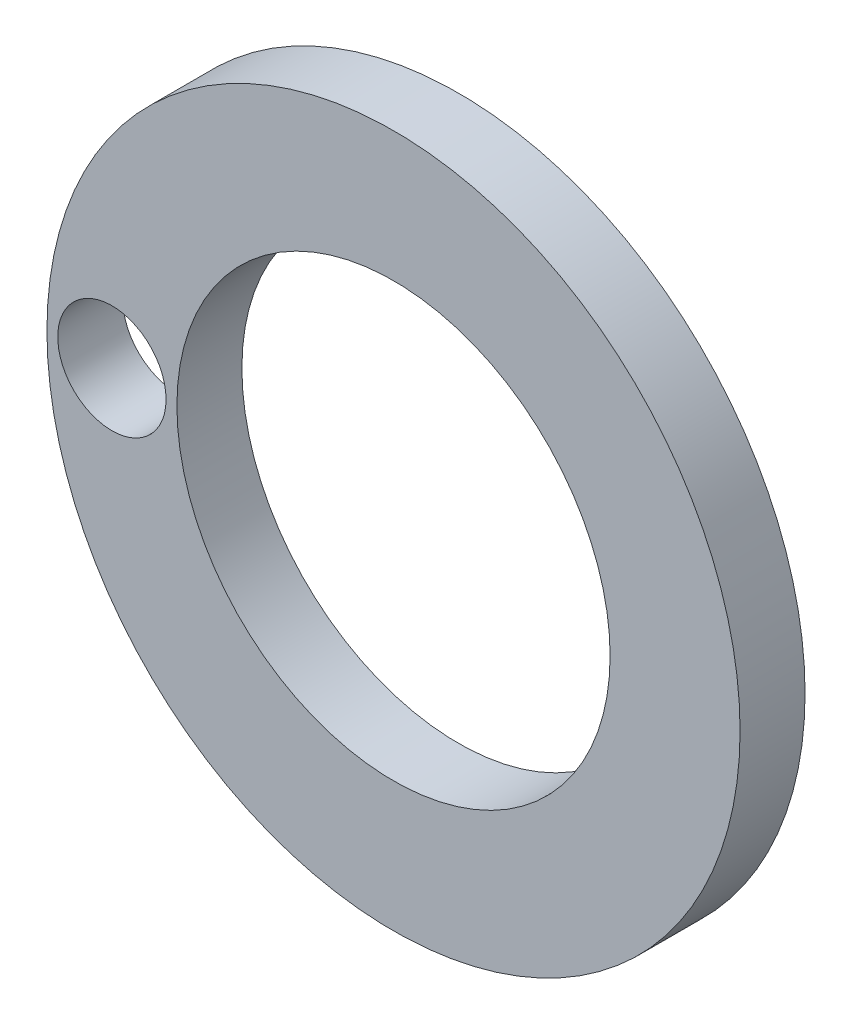
ISO-10303-21;
HEADER;
FILE_DESCRIPTION(('STEP AP214'),'2;1');
FILE_NAME('part.step','',(''),(''),'','','');
FILE_SCHEMA(('AUTOMOTIVE_DESIGN { 1 0 10303 214 1 1 1 1 }'));
ENDSEC;
DATA;
#1=APPLICATION_CONTEXT('core data for automotive mechanical design processes');
#2=APPLICATION_PROTOCOL_DEFINITION('international standard','automotive_design',2000,#1);
#3=PRODUCT_CONTEXT('',#1,'mechanical');
#4=PRODUCT('Part','Part','',(#3));
#5=PRODUCT_RELATED_PRODUCT_CATEGORY('part','',(#4));
#6=PRODUCT_DEFINITION_FORMATION('','',#4);
#7=PRODUCT_DEFINITION_CONTEXT('part definition',#1,'design');
#8=PRODUCT_DEFINITION('design','',#6,#7);
#9=PRODUCT_DEFINITION_SHAPE('','',#8);
#10=(LENGTH_UNIT() NAMED_UNIT(*) SI_UNIT(.MILLI.,.METRE.));
#11=(NAMED_UNIT(*) PLANE_ANGLE_UNIT() SI_UNIT($,.RADIAN.));
#12=(NAMED_UNIT(*) SI_UNIT($,.STERADIAN.) SOLID_ANGLE_UNIT());
#13=UNCERTAINTY_MEASURE_WITH_UNIT(LENGTH_MEASURE(1.E-05),#10,'distance_accuracy_value','');
#14=(GEOMETRIC_REPRESENTATION_CONTEXT(3) GLOBAL_UNCERTAINTY_ASSIGNED_CONTEXT((#13)) GLOBAL_UNIT_ASSIGNED_CONTEXT((#10,
#11,#12)) REPRESENTATION_CONTEXT('',''));
#15=CARTESIAN_POINT('',(0.,0.,0.));
#16=DIRECTION('',(0.,0.,1.));
#17=DIRECTION('',(1.,0.,0.));
#18=AXIS2_PLACEMENT_3D('',#15,#16,#17);
#19=CARTESIAN_POINT('',(-1.03053213689483,0.,5.849025));
#20=DIRECTION('',(0.,0.,1.));
#21=DIRECTION('',(1.,0.,0.));
#22=AXIS2_PLACEMENT_3D('',#19,#20,#21);
#23=PLANE('',#22);
#24=CARTESIAN_POINT('',(-1.03053213689483,0.,5.849025));
#25=DIRECTION('',(0.,0.,1.));
#26=DIRECTION('',(1.,0.,0.));
#27=AXIS2_PLACEMENT_3D('',#24,#25,#26);
#28=CIRCLE('',#27,28.9935);
#29=CARTESIAN_POINT('',(27.9629678631052,0.,5.849025));
#30=VERTEX_POINT('',#29);
#31=EDGE_CURVE('E43',#30,#30,#28,.T.);
#32=ORIENTED_EDGE('',*,*,#31,.F.);
#33=EDGE_LOOP('',(#32));
#34=FACE_BOUND('',#33,.T.);
#35=CARTESIAN_POINT('',(-1.03053213689483,0.,5.849025));
#36=DIRECTION('',(0.,0.,1.));
#37=DIRECTION('',(1.,0.,0.));
#38=AXIS2_PLACEMENT_3D('',#35,#36,#37);
#39=CIRCLE('',#38,46.3896);
#40=CARTESIAN_POINT('',(45.3590678631052,0.,5.849025));
#41=VERTEX_POINT('',#40);
#42=EDGE_CURVE('E10',#41,#41,#39,.T.);
#43=ORIENTED_EDGE('',*,*,#42,.T.);
#44=EDGE_LOOP('',(#43));
#45=FACE_BOUND('',#44,.T.);
#46=CARTESIAN_POINT('',(-38.7220821368948,0.,5.849025));
#47=DIRECTION('',(0.,0.,1.));
#48=DIRECTION('',(1.,0.,0.));
#49=AXIS2_PLACEMENT_3D('',#46,#47,#48);
#50=CIRCLE('',#49,7.248375);
#51=CARTESIAN_POINT('',(-31.4737071368948,0.,5.849025));
#52=VERTEX_POINT('',#51);
#53=EDGE_CURVE('E48',#52,#52,#50,.T.);
#54=ORIENTED_EDGE('',*,*,#53,.F.);
#55=EDGE_LOOP('',(#54));
#56=FACE_BOUND('',#55,.T.);
#57=ADVANCED_FACE('F32',(#34,#45,#56),#23,.T.);
#58=CARTESIAN_POINT('',(-1.03053213689483,0.,-2.849025));
#59=DIRECTION('',(0.,0.,1.));
#60=DIRECTION('',(1.,0.,0.));
#61=AXIS2_PLACEMENT_3D('',#58,#59,#60);
#62=PLANE('',#61);
#63=CARTESIAN_POINT('',(-1.03053213689483,0.,-2.849025));
#64=DIRECTION('',(0.,0.,1.));
#65=DIRECTION('',(1.,0.,0.));
#66=AXIS2_PLACEMENT_3D('',#63,#64,#65);
#67=CIRCLE('',#66,46.3896);
#68=CARTESIAN_POINT('',(45.3590678631052,0.,-2.849025));
#69=VERTEX_POINT('',#68);
#70=EDGE_CURVE('E36',#69,#69,#67,.T.);
#71=ORIENTED_EDGE('',*,*,#70,.F.);
#72=EDGE_LOOP('',(#71));
#73=FACE_BOUND('',#72,.T.);
#74=CARTESIAN_POINT('',(-1.03053213689483,0.,-2.849025));
#75=DIRECTION('',(0.,0.,1.));
#76=DIRECTION('',(1.,0.,0.));
#77=AXIS2_PLACEMENT_3D('',#74,#75,#76);
#78=CIRCLE('',#77,28.9935);
#79=CARTESIAN_POINT('',(27.9629678631052,0.,-2.849025));
#80=VERTEX_POINT('',#79);
#81=EDGE_CURVE('E45',#80,#80,#78,.T.);
#82=ORIENTED_EDGE('',*,*,#81,.T.);
#83=EDGE_LOOP('',(#82));
#84=FACE_BOUND('',#83,.T.);
#85=CARTESIAN_POINT('',(-38.7220821368948,0.,-2.849025));
#86=DIRECTION('',(0.,0.,1.));
#87=DIRECTION('',(1.,0.,0.));
#88=AXIS2_PLACEMENT_3D('',#85,#86,#87);
#89=CIRCLE('',#88,7.248375);
#90=CARTESIAN_POINT('',(-31.4737071368948,0.,-2.849025));
#91=VERTEX_POINT('',#90);
#92=EDGE_CURVE('E51',#91,#91,#89,.T.);
#93=ORIENTED_EDGE('',*,*,#92,.T.);
#94=EDGE_LOOP('',(#93));
#95=FACE_BOUND('',#94,.T.);
#96=ADVANCED_FACE('F61',(#73,#84,#95),#62,.F.);
#97=CARTESIAN_POINT('',(-1.03053213689483,0.,5.849025));
#98=DIRECTION('',(0.,0.,-1.));
#99=DIRECTION('',(-1.,0.,0.));
#100=AXIS2_PLACEMENT_3D('',#97,#98,#99);
#101=CYLINDRICAL_SURFACE('',#100,46.3896);
#102=ORIENTED_EDGE('',*,*,#42,.F.);
#103=EDGE_LOOP('',(#102));
#104=FACE_BOUND('',#103,.T.);
#105=ORIENTED_EDGE('',*,*,#70,.T.);
#106=EDGE_LOOP('',(#105));
#107=FACE_BOUND('',#106,.T.);
#108=ADVANCED_FACE('F34',(#104,#107),#101,.T.);
#109=CARTESIAN_POINT('',(-1.03053213689483,0.,5.849025));
#110=DIRECTION('',(0.,0.,-1.));
#111=DIRECTION('',(-1.,0.,0.));
#112=AXIS2_PLACEMENT_3D('',#109,#110,#111);
#113=CYLINDRICAL_SURFACE('',#112,28.9935);
#114=ORIENTED_EDGE('',*,*,#31,.T.);
#115=EDGE_LOOP('',(#114));
#116=FACE_BOUND('',#115,.T.);
#117=ORIENTED_EDGE('',*,*,#81,.F.);
#118=EDGE_LOOP('',(#117));
#119=FACE_BOUND('',#118,.T.);
#120=ADVANCED_FACE('F70',(#116,#119),#113,.F.);
#121=CARTESIAN_POINT('',(-38.7220821368948,0.,5.849025));
#122=DIRECTION('',(0.,0.,-1.));
#123=DIRECTION('',(-1.,0.,0.));
#124=AXIS2_PLACEMENT_3D('',#121,#122,#123);
#125=CYLINDRICAL_SURFACE('',#124,7.248375);
#126=ORIENTED_EDGE('',*,*,#53,.T.);
#127=EDGE_LOOP('',(#126));
#128=FACE_BOUND('',#127,.T.);
#129=ORIENTED_EDGE('',*,*,#92,.F.);
#130=EDGE_LOOP('',(#129));
#131=FACE_BOUND('',#130,.T.);
#132=ADVANCED_FACE('F57',(#128,#131),#125,.F.);
#133=CLOSED_SHELL('',(#57,#96,#108,#120,#132));
#134=MANIFOLD_SOLID_BREP('B2',#133);
#135=ADVANCED_BREP_SHAPE_REPRESENTATION('',(#18,#134),#14);
#136=SHAPE_DEFINITION_REPRESENTATION(#9,#135);
ENDSEC;
END-ISO-10303-21;
